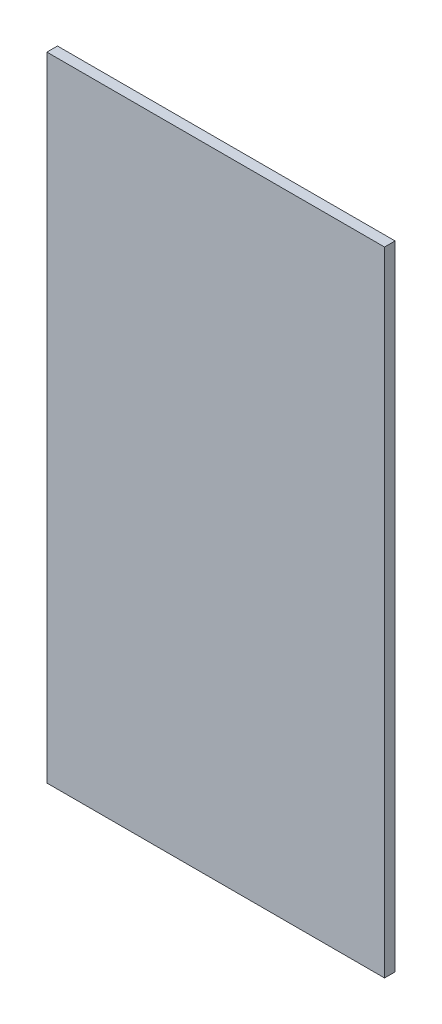
ISO-10303-21;
HEADER;
FILE_DESCRIPTION(('STEP AP214'),'2;1');
FILE_NAME('part.step','',(''),(''),'','','');
FILE_SCHEMA(('AUTOMOTIVE_DESIGN { 1 0 10303 214 1 1 1 1 }'));
ENDSEC;
DATA;
#1=APPLICATION_CONTEXT('core data for automotive mechanical design processes');
#2=APPLICATION_PROTOCOL_DEFINITION('international standard','automotive_design',2000,#1);
#3=PRODUCT_CONTEXT('',#1,'mechanical');
#4=PRODUCT('Part','Part','',(#3));
#5=PRODUCT_RELATED_PRODUCT_CATEGORY('part','',(#4));
#6=PRODUCT_DEFINITION_FORMATION('','',#4);
#7=PRODUCT_DEFINITION_CONTEXT('part definition',#1,'design');
#8=PRODUCT_DEFINITION('design','',#6,#7);
#9=PRODUCT_DEFINITION_SHAPE('','',#8);
#10=(LENGTH_UNIT() NAMED_UNIT(*) SI_UNIT(.MILLI.,.METRE.));
#11=(NAMED_UNIT(*) PLANE_ANGLE_UNIT() SI_UNIT($,.RADIAN.));
#12=(NAMED_UNIT(*) SI_UNIT($,.STERADIAN.) SOLID_ANGLE_UNIT());
#13=UNCERTAINTY_MEASURE_WITH_UNIT(LENGTH_MEASURE(1.E-05),#10,'distance_accuracy_value','');
#14=(GEOMETRIC_REPRESENTATION_CONTEXT(3) GLOBAL_UNCERTAINTY_ASSIGNED_CONTEXT((#13)) GLOBAL_UNIT_ASSIGNED_CONTEXT((#10,
#11,#12)) REPRESENTATION_CONTEXT('',''));
#15=CARTESIAN_POINT('',(0.,0.,0.));
#16=DIRECTION('',(0.,0.,1.));
#17=DIRECTION('',(1.,0.,0.));
#18=AXIS2_PLACEMENT_3D('',#15,#16,#17);
#19=CARTESIAN_POINT('',(-514.889613733906,-291.18974248927,6.35));
#20=DIRECTION('',(1.,0.,0.));
#21=DIRECTION('',(0.,0.,-1.));
#22=AXIS2_PLACEMENT_3D('',#19,#20,#21);
#23=PLANE('',#22);
#24=DIRECTION('',(0.,-1.,0.));
#25=VECTOR('',#24,1.);
#26=CARTESIAN_POINT('',(-514.889613733906,-291.18974248927,0.));
#27=LINE('',#26,#25);
#28=CARTESIAN_POINT('',(-514.889613733906,-291.18974248927,0.));
#29=VERTEX_POINT('',#28);
#30=CARTESIAN_POINT('',(-514.889613733906,-672.18974248927,0.));
#31=VERTEX_POINT('',#30);
#32=EDGE_CURVE('E96',#29,#31,#27,.T.);
#33=ORIENTED_EDGE('',*,*,#32,.T.);
#34=DIRECTION('',(0.,0.,-1.));
#35=VECTOR('',#34,1.);
#36=CARTESIAN_POINT('',(-514.889613733906,-672.18974248927,6.35));
#37=LINE('',#36,#35);
#38=CARTESIAN_POINT('',(-514.889613733906,-672.18974248927,6.35));
#39=VERTEX_POINT('',#38);
#40=EDGE_CURVE('E11',#39,#31,#37,.T.);
#41=ORIENTED_EDGE('',*,*,#40,.F.);
#42=DIRECTION('',(0.,-1.,0.));
#43=VECTOR('',#42,1.);
#44=CARTESIAN_POINT('',(-514.889613733906,-291.18974248927,6.35));
#45=LINE('',#44,#43);
#46=CARTESIAN_POINT('',(-514.889613733906,-291.18974248927,6.35));
#47=VERTEX_POINT('',#46);
#48=EDGE_CURVE('E84',#47,#39,#45,.T.);
#49=ORIENTED_EDGE('',*,*,#48,.F.);
#50=DIRECTION('',(0.,0.,-1.));
#51=VECTOR('',#50,1.);
#52=CARTESIAN_POINT('',(-514.889613733906,-291.18974248927,6.35));
#53=LINE('',#52,#51);
#54=EDGE_CURVE('E92',#47,#29,#53,.T.);
#55=ORIENTED_EDGE('',*,*,#54,.T.);
#56=EDGE_LOOP('',(#33,#41,#49,#55));
#57=FACE_BOUND('',#56,.T.);
#58=ADVANCED_FACE('F33',(#57),#23,.F.);
#59=CARTESIAN_POINT('',(-514.889613733906,-672.18974248927,6.35));
#60=DIRECTION('',(0.,1.,0.));
#61=DIRECTION('',(0.,0.,1.));
#62=AXIS2_PLACEMENT_3D('',#59,#60,#61);
#63=PLANE('',#62);
#64=DIRECTION('',(1.,0.,0.));
#65=VECTOR('',#64,1.);
#66=CARTESIAN_POINT('',(-514.889613733906,-672.18974248927,0.));
#67=LINE('',#66,#65);
#68=CARTESIAN_POINT('',(-311.689613733906,-672.18974248927,0.));
#69=VERTEX_POINT('',#68);
#70=EDGE_CURVE('E88',#31,#69,#67,.T.);
#71=ORIENTED_EDGE('',*,*,#70,.T.);
#72=DIRECTION('',(0.,0.,-1.));
#73=VECTOR('',#72,1.);
#74=CARTESIAN_POINT('',(-311.689613733906,-672.18974248927,6.35));
#75=LINE('',#74,#73);
#76=CARTESIAN_POINT('',(-311.689613733906,-672.18974248927,6.35));
#77=VERTEX_POINT('',#76);
#78=EDGE_CURVE('E41',#77,#69,#75,.T.);
#79=ORIENTED_EDGE('',*,*,#78,.F.);
#80=DIRECTION('',(1.,0.,0.));
#81=VECTOR('',#80,1.);
#82=CARTESIAN_POINT('',(-514.889613733906,-672.18974248927,6.35));
#83=LINE('',#82,#81);
#84=EDGE_CURVE('E79',#39,#77,#83,.T.);
#85=ORIENTED_EDGE('',*,*,#84,.F.);
#86=ORIENTED_EDGE('',*,*,#40,.T.);
#87=EDGE_LOOP('',(#71,#79,#85,#86));
#88=FACE_BOUND('',#87,.T.);
#89=ADVANCED_FACE('F87',(#88),#63,.F.);
#90=CARTESIAN_POINT('',(-311.689613733906,-291.18974248927,6.35));
#91=DIRECTION('',(-1.,0.,0.));
#92=DIRECTION('',(0.,-1.,0.));
#93=AXIS2_PLACEMENT_3D('',#90,#91,#92);
#94=PLANE('',#93);
#95=DIRECTION('',(0.,1.,0.));
#96=VECTOR('',#95,1.);
#97=CARTESIAN_POINT('',(-311.689613733906,-291.18974248927,0.));
#98=LINE('',#97,#96);
#99=CARTESIAN_POINT('',(-311.689613733906,-291.18974248927,0.));
#100=VERTEX_POINT('',#99);
#101=EDGE_CURVE('E66',#69,#100,#98,.T.);
#102=ORIENTED_EDGE('',*,*,#101,.T.);
#103=DIRECTION('',(0.,0.,-1.));
#104=VECTOR('',#103,1.);
#105=CARTESIAN_POINT('',(-311.689613733906,-291.18974248927,6.35));
#106=LINE('',#105,#104);
#107=CARTESIAN_POINT('',(-311.689613733906,-291.18974248927,6.35));
#108=VERTEX_POINT('',#107);
#109=EDGE_CURVE('E89',#108,#100,#106,.T.);
#110=ORIENTED_EDGE('',*,*,#109,.F.);
#111=DIRECTION('',(0.,1.,0.));
#112=VECTOR('',#111,1.);
#113=CARTESIAN_POINT('',(-311.689613733906,-291.18974248927,6.35));
#114=LINE('',#113,#112);
#115=EDGE_CURVE('E82',#77,#108,#114,.T.);
#116=ORIENTED_EDGE('',*,*,#115,.F.);
#117=ORIENTED_EDGE('',*,*,#78,.T.);
#118=EDGE_LOOP('',(#102,#110,#116,#117));
#119=FACE_BOUND('',#118,.T.);
#120=ADVANCED_FACE('F90',(#119),#94,.F.);
#121=CARTESIAN_POINT('',(-514.889613733906,-291.18974248927,6.35));
#122=DIRECTION('',(0.,-1.,0.));
#123=DIRECTION('',(0.,0.,-1.));
#124=AXIS2_PLACEMENT_3D('',#121,#122,#123);
#125=PLANE('',#124);
#126=DIRECTION('',(-1.,0.,0.));
#127=VECTOR('',#126,1.);
#128=CARTESIAN_POINT('',(-514.889613733906,-291.18974248927,0.));
#129=LINE('',#128,#127);
#130=EDGE_CURVE('E72',#100,#29,#129,.T.);
#131=ORIENTED_EDGE('',*,*,#130,.T.);
#132=ORIENTED_EDGE('',*,*,#54,.F.);
#133=DIRECTION('',(-1.,0.,0.));
#134=VECTOR('',#133,1.);
#135=CARTESIAN_POINT('',(-514.889613733906,-291.18974248927,6.35));
#136=LINE('',#135,#134);
#137=EDGE_CURVE('E49',#108,#47,#136,.T.);
#138=ORIENTED_EDGE('',*,*,#137,.F.);
#139=ORIENTED_EDGE('',*,*,#109,.T.);
#140=EDGE_LOOP('',(#131,#132,#138,#139));
#141=FACE_BOUND('',#140,.T.);
#142=ADVANCED_FACE('F103',(#141),#125,.F.);
#143=CARTESIAN_POINT('',(0.,0.,6.35));
#144=DIRECTION('',(0.,0.,1.));
#145=DIRECTION('',(1.,0.,0.));
#146=AXIS2_PLACEMENT_3D('',#143,#144,#145);
#147=PLANE('',#146);
#148=ORIENTED_EDGE('',*,*,#48,.T.);
#149=ORIENTED_EDGE('',*,*,#84,.T.);
#150=ORIENTED_EDGE('',*,*,#115,.T.);
#151=ORIENTED_EDGE('',*,*,#137,.T.);
#152=EDGE_LOOP('',(#148,#149,#150,#151));
#153=FACE_BOUND('',#152,.T.);
#154=ADVANCED_FACE('F80',(#153),#147,.T.);
#155=CARTESIAN_POINT('',(0.,0.,0.));
#156=DIRECTION('',(0.,0.,1.));
#157=DIRECTION('',(1.,0.,0.));
#158=AXIS2_PLACEMENT_3D('',#155,#156,#157);
#159=PLANE('',#158);
#160=ORIENTED_EDGE('',*,*,#32,.F.);
#161=ORIENTED_EDGE('',*,*,#130,.F.);
#162=ORIENTED_EDGE('',*,*,#101,.F.);
#163=ORIENTED_EDGE('',*,*,#70,.F.);
#164=EDGE_LOOP('',(#160,#161,#162,#163));
#165=FACE_BOUND('',#164,.T.);
#166=ADVANCED_FACE('F106',(#165),#159,.F.);
#167=CLOSED_SHELL('',(#58,#89,#120,#142,#154,#166));
#168=MANIFOLD_SOLID_BREP('B2',#167);
#169=ADVANCED_BREP_SHAPE_REPRESENTATION('',(#18,#168),#14);
#170=SHAPE_DEFINITION_REPRESENTATION(#9,#169);
ENDSEC;
END-ISO-10303-21;
